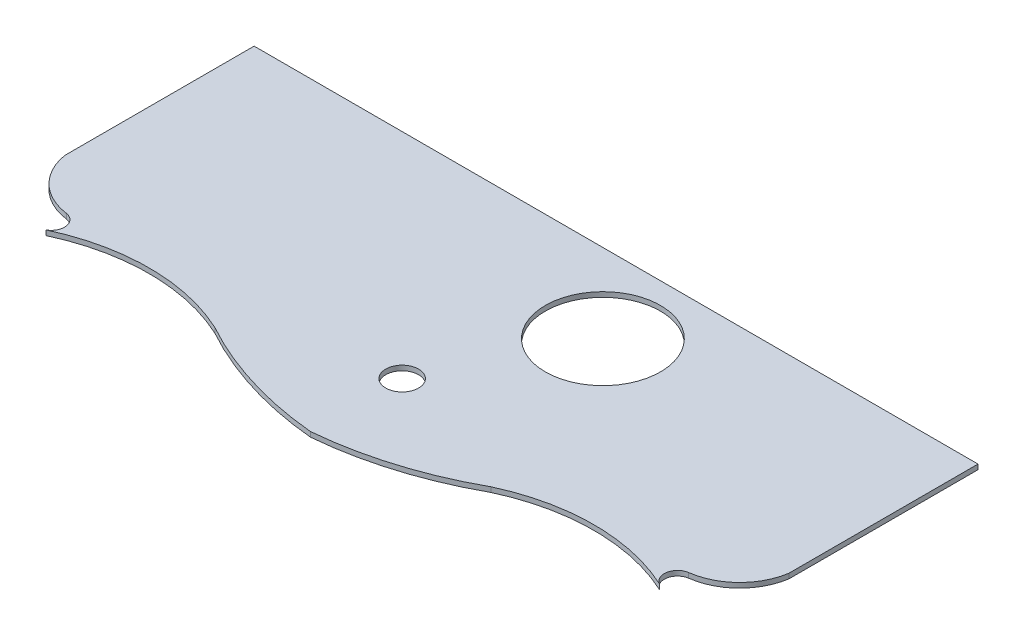
ISO-10303-21;
HEADER;
FILE_DESCRIPTION(('STEP AP214'),'2;1');
FILE_NAME('part.step','',(''),(''),'','','');
FILE_SCHEMA(('AUTOMOTIVE_DESIGN { 1 0 10303 214 1 1 1 1 }'));
ENDSEC;
DATA;
#1=APPLICATION_CONTEXT('core data for automotive mechanical design processes');
#2=APPLICATION_PROTOCOL_DEFINITION('international standard','automotive_design',2000,#1);
#3=PRODUCT_CONTEXT('',#1,'mechanical');
#4=PRODUCT('Part','Part','',(#3));
#5=PRODUCT_RELATED_PRODUCT_CATEGORY('part','',(#4));
#6=PRODUCT_DEFINITION_FORMATION('','',#4);
#7=PRODUCT_DEFINITION_CONTEXT('part definition',#1,'design');
#8=PRODUCT_DEFINITION('design','',#6,#7);
#9=PRODUCT_DEFINITION_SHAPE('','',#8);
#10=(LENGTH_UNIT() NAMED_UNIT(*) SI_UNIT(.MILLI.,.METRE.));
#11=(NAMED_UNIT(*) PLANE_ANGLE_UNIT() SI_UNIT($,.RADIAN.));
#12=(NAMED_UNIT(*) SI_UNIT($,.STERADIAN.) SOLID_ANGLE_UNIT());
#13=UNCERTAINTY_MEASURE_WITH_UNIT(LENGTH_MEASURE(1.E-05),#10,'distance_accuracy_value','');
#14=(GEOMETRIC_REPRESENTATION_CONTEXT(3) GLOBAL_UNCERTAINTY_ASSIGNED_CONTEXT((#13)) GLOBAL_UNIT_ASSIGNED_CONTEXT((#10,
#11,#12)) REPRESENTATION_CONTEXT('',''));
#15=CARTESIAN_POINT('',(0.,0.,0.));
#16=DIRECTION('',(0.,0.,1.));
#17=DIRECTION('',(1.,0.,0.));
#18=AXIS2_PLACEMENT_3D('',#15,#16,#17);
#19=CARTESIAN_POINT('',(-95.1559154698416,243.301123672656,26.4829496841931));
#20=DIRECTION('',(0.,-1.,0.));
#21=DIRECTION('',(0.,0.,-1.));
#22=AXIS2_PLACEMENT_3D('',#19,#20,#21);
#23=CYLINDRICAL_SURFACE('',#22,4.0002695786783);
#24=CARTESIAN_POINT('',(-95.1559154698416,4.5,26.4829496841931));
#25=DIRECTION('',(0.,1.,0.));
#26=DIRECTION('',(0.,0.,1.));
#27=AXIS2_PLACEMENT_3D('',#24,#25,#26);
#28=CIRCLE('',#27,4.0002695786783);
#29=CARTESIAN_POINT('',(-94.5,4.5,22.5368209992004));
#30=VERTEX_POINT('',#29);
#31=CARTESIAN_POINT('',(-93.25,4.5,30.));
#32=VERTEX_POINT('',#31);
#33=EDGE_CURVE('E172',#30,#32,#28,.F.);
#34=ORIENTED_EDGE('',*,*,#33,.F.);
#35=DIRECTION('',(0.,-1.,0.));
#36=VECTOR('',#35,1.);
#37=CARTESIAN_POINT('',(-94.5,243.301123672656,22.5368209992004));
#38=LINE('',#37,#36);
#39=CARTESIAN_POINT('',(-94.5,3.,22.5368209992004));
#40=VERTEX_POINT('',#39);
#41=EDGE_CURVE('E44',#30,#40,#38,.T.);
#42=ORIENTED_EDGE('',*,*,#41,.T.);
#43=CARTESIAN_POINT('',(-95.1559154698416,3.,26.4829496841931));
#44=DIRECTION('',(0.,1.,0.));
#45=DIRECTION('',(0.,0.,1.));
#46=AXIS2_PLACEMENT_3D('',#43,#44,#45);
#47=CIRCLE('',#46,4.0002695786783);
#48=CARTESIAN_POINT('',(-93.25,3.,30.));
#49=VERTEX_POINT('',#48);
#50=EDGE_CURVE('E181',#40,#49,#47,.F.);
#51=ORIENTED_EDGE('',*,*,#50,.T.);
#52=DIRECTION('',(0.,-1.,0.));
#53=VECTOR('',#52,1.);
#54=CARTESIAN_POINT('',(-93.25,243.301123672656,30.));
#55=LINE('',#54,#53);
#56=EDGE_CURVE('E107',#32,#49,#55,.T.);
#57=ORIENTED_EDGE('',*,*,#56,.F.);
#58=EDGE_LOOP('',(#34,#42,#51,#57));
#59=FACE_BOUND('',#58,.T.);
#60=ADVANCED_FACE('F41',(#59),#23,.F.);
#61=CARTESIAN_POINT('',(-67.6062576231202,243.301123672656,85.029602130527));
#62=DIRECTION('',(0.,-1.,0.));
#63=DIRECTION('',(0.,0.,-1.));
#64=AXIS2_PLACEMENT_3D('',#61,#62,#63);
#65=CYLINDRICAL_SURFACE('',#64,60.7112727072649);
#66=CARTESIAN_POINT('',(-67.6062576231202,4.5,85.029602130527));
#67=DIRECTION('',(0.,1.,0.));
#68=DIRECTION('',(0.,0.,1.));
#69=AXIS2_PLACEMENT_3D('',#66,#67,#68);
#70=CIRCLE('',#69,60.7112727072649);
#71=CARTESIAN_POINT('',(-41.9625152462405,4.5,30.));
#72=VERTEX_POINT('',#71);
#73=EDGE_CURVE('E113',#32,#72,#70,.F.);
#74=ORIENTED_EDGE('',*,*,#73,.F.);
#75=ORIENTED_EDGE('',*,*,#56,.T.);
#76=CARTESIAN_POINT('',(-67.6062576231202,3.,85.029602130527));
#77=DIRECTION('',(0.,1.,0.));
#78=DIRECTION('',(0.,0.,1.));
#79=AXIS2_PLACEMENT_3D('',#76,#77,#78);
#80=CIRCLE('',#79,60.7112727072649);
#81=CARTESIAN_POINT('',(-41.9625152462405,3.,30.));
#82=VERTEX_POINT('',#81);
#83=EDGE_CURVE('E185',#49,#82,#80,.F.);
#84=ORIENTED_EDGE('',*,*,#83,.T.);
#85=DIRECTION('',(0.,-1.,0.));
#86=VECTOR('',#85,1.);
#87=CARTESIAN_POINT('',(-41.9625152462405,243.301123672656,30.));
#88=LINE('',#87,#86);
#89=EDGE_CURVE('E184',#72,#82,#88,.T.);
#90=ORIENTED_EDGE('',*,*,#89,.F.);
#91=EDGE_LOOP('',(#74,#75,#84,#90));
#92=FACE_BOUND('',#91,.T.);
#93=ADVANCED_FACE('F245',(#92),#65,.F.);
#94=CARTESIAN_POINT('',(9.52483016864245,243.301123672656,-62.9793470940987));
#95=DIRECTION('',(0.,-1.,0.));
#96=DIRECTION('',(0.,0.,-1.));
#97=AXIS2_PLACEMENT_3D('',#94,#95,#96);
#98=CYLINDRICAL_SURFACE('',#97,106.283139415038);
#99=CARTESIAN_POINT('',(9.52483016864245,4.5,-62.9793470940987));
#100=DIRECTION('',(0.,1.,0.));
#101=DIRECTION('',(0.,0.,1.));
#102=AXIS2_PLACEMENT_3D('',#99,#100,#101);
#103=CIRCLE('',#102,106.283139415038);
#104=CARTESIAN_POINT('',(0.,4.5,42.8761361562973));
#105=VERTEX_POINT('',#104);
#106=EDGE_CURVE('E158',#72,#105,#103,.T.);
#107=ORIENTED_EDGE('',*,*,#106,.F.);
#108=ORIENTED_EDGE('',*,*,#89,.T.);
#109=CARTESIAN_POINT('',(9.52483016864245,3.,-62.9793470940987));
#110=DIRECTION('',(0.,1.,0.));
#111=DIRECTION('',(0.,0.,1.));
#112=AXIS2_PLACEMENT_3D('',#109,#110,#111);
#113=CIRCLE('',#112,106.283139415038);
#114=CARTESIAN_POINT('',(0.,3.,42.8761361562973));
#115=VERTEX_POINT('',#114);
#116=EDGE_CURVE('E173',#82,#115,#113,.T.);
#117=ORIENTED_EDGE('',*,*,#116,.T.);
#118=DIRECTION('',(0.,-1.,0.));
#119=VECTOR('',#118,1.);
#120=CARTESIAN_POINT('',(0.,243.301123672656,42.8761361562973));
#121=LINE('',#120,#119);
#122=EDGE_CURVE('E169',#105,#115,#121,.T.);
#123=ORIENTED_EDGE('',*,*,#122,.F.);
#124=EDGE_LOOP('',(#107,#108,#117,#123));
#125=FACE_BOUND('',#124,.T.);
#126=ADVANCED_FACE('F250',(#125),#98,.T.);
#127=CARTESIAN_POINT('',(-9.52483016864245,243.301123672656,-62.9793470940987));
#128=DIRECTION('',(0.,-1.,0.));
#129=DIRECTION('',(0.,0.,-1.));
#130=AXIS2_PLACEMENT_3D('',#127,#128,#129);
#131=CYLINDRICAL_SURFACE('',#130,106.283139415038);
#132=DIRECTION('',(0.,-1.,0.));
#133=VECTOR('',#132,1.);
#134=CARTESIAN_POINT('',(41.9625152462405,243.301123672656,30.));
#135=LINE('',#134,#133);
#136=CARTESIAN_POINT('',(41.9625152462405,4.5,30.));
#137=VERTEX_POINT('',#136);
#138=CARTESIAN_POINT('',(41.9625152462405,3.,30.));
#139=VERTEX_POINT('',#138);
#140=EDGE_CURVE('E164',#137,#139,#135,.T.);
#141=ORIENTED_EDGE('',*,*,#140,.F.);
#142=CARTESIAN_POINT('',(-9.52483016864245,4.5,-62.9793470940987));
#143=DIRECTION('',(0.,1.,0.));
#144=DIRECTION('',(0.,0.,1.));
#145=AXIS2_PLACEMENT_3D('',#142,#143,#144);
#146=CIRCLE('',#145,106.283139415038);
#147=EDGE_CURVE('E166',#137,#105,#146,.F.);
#148=ORIENTED_EDGE('',*,*,#147,.T.);
#149=ORIENTED_EDGE('',*,*,#122,.T.);
#150=CARTESIAN_POINT('',(-9.52483016864245,3.,-62.9793470940987));
#151=DIRECTION('',(0.,1.,0.));
#152=DIRECTION('',(0.,0.,1.));
#153=AXIS2_PLACEMENT_3D('',#150,#151,#152);
#154=CIRCLE('',#153,106.283139415038);
#155=EDGE_CURVE('E176',#139,#115,#154,.F.);
#156=ORIENTED_EDGE('',*,*,#155,.F.);
#157=EDGE_LOOP('',(#141,#148,#149,#156));
#158=FACE_BOUND('',#157,.T.);
#159=ADVANCED_FACE('F252',(#158),#131,.T.);
#160=CARTESIAN_POINT('',(67.6062576231202,243.301123672656,85.029602130527));
#161=DIRECTION('',(0.,-1.,0.));
#162=DIRECTION('',(0.,0.,-1.));
#163=AXIS2_PLACEMENT_3D('',#160,#161,#162);
#164=CYLINDRICAL_SURFACE('',#163,60.7112727072649);
#165=DIRECTION('',(0.,-1.,0.));
#166=VECTOR('',#165,1.);
#167=CARTESIAN_POINT('',(93.25,243.301123672656,30.));
#168=LINE('',#167,#166);
#169=CARTESIAN_POINT('',(93.25,4.5,30.));
#170=VERTEX_POINT('',#169);
#171=CARTESIAN_POINT('',(93.25,3.,30.));
#172=VERTEX_POINT('',#171);
#173=EDGE_CURVE('E165',#170,#172,#168,.T.);
#174=ORIENTED_EDGE('',*,*,#173,.F.);
#175=CARTESIAN_POINT('',(67.6062576231202,4.5,85.029602130527));
#176=DIRECTION('',(0.,1.,0.));
#177=DIRECTION('',(0.,0.,1.));
#178=AXIS2_PLACEMENT_3D('',#175,#176,#177);
#179=CIRCLE('',#178,60.7112727072649);
#180=EDGE_CURVE('E167',#170,#137,#179,.T.);
#181=ORIENTED_EDGE('',*,*,#180,.T.);
#182=ORIENTED_EDGE('',*,*,#140,.T.);
#183=CARTESIAN_POINT('',(67.6062576231202,3.,85.029602130527));
#184=DIRECTION('',(0.,1.,0.));
#185=DIRECTION('',(0.,0.,1.));
#186=AXIS2_PLACEMENT_3D('',#183,#184,#185);
#187=CIRCLE('',#186,60.7112727072649);
#188=EDGE_CURVE('E213',#172,#139,#187,.T.);
#189=ORIENTED_EDGE('',*,*,#188,.F.);
#190=EDGE_LOOP('',(#174,#181,#182,#189));
#191=FACE_BOUND('',#190,.T.);
#192=ADVANCED_FACE('F258',(#191),#164,.F.);
#193=CARTESIAN_POINT('',(95.1559154698416,243.301123672656,26.4829496841931));
#194=DIRECTION('',(0.,-1.,0.));
#195=DIRECTION('',(0.,0.,-1.));
#196=AXIS2_PLACEMENT_3D('',#193,#194,#195);
#197=CYLINDRICAL_SURFACE('',#196,4.0002695786783);
#198=DIRECTION('',(0.,-1.,0.));
#199=VECTOR('',#198,1.);
#200=CARTESIAN_POINT('',(94.5,243.301123672656,22.5368209992005));
#201=LINE('',#200,#199);
#202=CARTESIAN_POINT('',(94.5,4.5,22.5368209992005));
#203=VERTEX_POINT('',#202);
#204=CARTESIAN_POINT('',(94.5,3.,22.5368209992005));
#205=VERTEX_POINT('',#204);
#206=EDGE_CURVE('E161',#203,#205,#201,.T.);
#207=ORIENTED_EDGE('',*,*,#206,.F.);
#208=CARTESIAN_POINT('',(95.1559154698416,4.5,26.4829496841931));
#209=DIRECTION('',(0.,1.,0.));
#210=DIRECTION('',(0.,0.,1.));
#211=AXIS2_PLACEMENT_3D('',#208,#209,#210);
#212=CIRCLE('',#211,4.0002695786783);
#213=EDGE_CURVE('E162',#203,#170,#212,.T.);
#214=ORIENTED_EDGE('',*,*,#213,.T.);
#215=ORIENTED_EDGE('',*,*,#173,.T.);
#216=CARTESIAN_POINT('',(95.1559154698416,3.,26.4829496841931));
#217=DIRECTION('',(0.,1.,0.));
#218=DIRECTION('',(0.,0.,1.));
#219=AXIS2_PLACEMENT_3D('',#216,#217,#218);
#220=CIRCLE('',#219,4.0002695786783);
#221=EDGE_CURVE('E216',#205,#172,#220,.T.);
#222=ORIENTED_EDGE('',*,*,#221,.F.);
#223=EDGE_LOOP('',(#207,#214,#215,#222));
#224=FACE_BOUND('',#223,.T.);
#225=ADVANCED_FACE('F257',(#224),#197,.F.);
#226=CARTESIAN_POINT('',(92.2220271706997,243.301123672656,4.68154615424297));
#227=DIRECTION('',(0.,-1.,0.));
#228=DIRECTION('',(0.,0.,-1.));
#229=AXIS2_PLACEMENT_3D('',#226,#227,#228);
#230=CYLINDRICAL_SURFACE('',#229,18.);
#231=DIRECTION('',(0.,-1.,0.));
#232=VECTOR('',#231,1.);
#233=CARTESIAN_POINT('',(110.,243.301123672656,7.50000000000001));
#234=LINE('',#233,#232);
#235=CARTESIAN_POINT('',(110.,4.5,7.50000000000001));
#236=VERTEX_POINT('',#235);
#237=CARTESIAN_POINT('',(110.,3.,7.50000000000001));
#238=VERTEX_POINT('',#237);
#239=EDGE_CURVE('E153',#236,#238,#234,.T.);
#240=ORIENTED_EDGE('',*,*,#239,.F.);
#241=CARTESIAN_POINT('',(92.2220271706997,4.5,4.68154615424297));
#242=DIRECTION('',(0.,1.,0.));
#243=DIRECTION('',(0.,0.,1.));
#244=AXIS2_PLACEMENT_3D('',#241,#242,#243);
#245=CIRCLE('',#244,18.);
#246=EDGE_CURVE('E157',#236,#203,#245,.F.);
#247=ORIENTED_EDGE('',*,*,#246,.T.);
#248=ORIENTED_EDGE('',*,*,#206,.T.);
#249=CARTESIAN_POINT('',(92.2220271706997,3.,4.68154615424297));
#250=DIRECTION('',(0.,1.,0.));
#251=DIRECTION('',(0.,0.,1.));
#252=AXIS2_PLACEMENT_3D('',#249,#250,#251);
#253=CIRCLE('',#252,18.);
#254=EDGE_CURVE('E218',#238,#205,#253,.F.);
#255=ORIENTED_EDGE('',*,*,#254,.F.);
#256=EDGE_LOOP('',(#240,#247,#248,#255));
#257=FACE_BOUND('',#256,.T.);
#258=ADVANCED_FACE('F262',(#257),#230,.T.);
#259=CARTESIAN_POINT('',(110.,243.301123672656,0.));
#260=DIRECTION('',(-1.,0.,0.));
#261=DIRECTION('',(0.,0.,1.));
#262=AXIS2_PLACEMENT_3D('',#259,#260,#261);
#263=PLANE('',#262);
#264=DIRECTION('',(0.,0.,-1.));
#265=VECTOR('',#264,1.);
#266=CARTESIAN_POINT('',(110.,4.5,0.));
#267=LINE('',#266,#265);
#268=CARTESIAN_POINT('',(110.,4.5,-50.));
#269=VERTEX_POINT('',#268);
#270=EDGE_CURVE('E49',#236,#269,#267,.T.);
#271=ORIENTED_EDGE('',*,*,#270,.F.);
#272=ORIENTED_EDGE('',*,*,#239,.T.);
#273=DIRECTION('',(0.,0.,-1.));
#274=VECTOR('',#273,1.);
#275=CARTESIAN_POINT('',(110.,3.,0.));
#276=LINE('',#275,#274);
#277=CARTESIAN_POINT('',(110.,3.,-50.));
#278=VERTEX_POINT('',#277);
#279=EDGE_CURVE('E149',#238,#278,#276,.T.);
#280=ORIENTED_EDGE('',*,*,#279,.T.);
#281=DIRECTION('',(0.,-1.,0.));
#282=VECTOR('',#281,1.);
#283=CARTESIAN_POINT('',(110.,243.301123672656,-50.));
#284=LINE('',#283,#282);
#285=EDGE_CURVE('E144',#269,#278,#284,.T.);
#286=ORIENTED_EDGE('',*,*,#285,.F.);
#287=EDGE_LOOP('',(#271,#272,#280,#286));
#288=FACE_BOUND('',#287,.T.);
#289=ADVANCED_FACE('F268',(#288),#263,.F.);
#290=CARTESIAN_POINT('',(0.,243.301123672656,-50.));
#291=DIRECTION('',(0.,0.,-1.));
#292=DIRECTION('',(-1.,0.,0.));
#293=AXIS2_PLACEMENT_3D('',#290,#291,#292);
#294=PLANE('',#293);
#295=DIRECTION('',(0.,-1.,0.));
#296=VECTOR('',#295,1.);
#297=CARTESIAN_POINT('',(-110.,243.301123672656,-50.));
#298=LINE('',#297,#296);
#299=CARTESIAN_POINT('',(-110.,4.5,-50.));
#300=VERTEX_POINT('',#299);
#301=CARTESIAN_POINT('',(-110.,3.,-50.));
#302=VERTEX_POINT('',#301);
#303=EDGE_CURVE('E135',#300,#302,#298,.T.);
#304=ORIENTED_EDGE('',*,*,#303,.F.);
#305=DIRECTION('',(1.,0.,0.));
#306=VECTOR('',#305,1.);
#307=CARTESIAN_POINT('',(0.,4.5,-50.));
#308=LINE('',#307,#306);
#309=EDGE_CURVE('E136',#300,#269,#308,.T.);
#310=ORIENTED_EDGE('',*,*,#309,.T.);
#311=ORIENTED_EDGE('',*,*,#285,.T.);
#312=DIRECTION('',(1.,0.,0.));
#313=VECTOR('',#312,1.);
#314=CARTESIAN_POINT('',(0.,3.,-50.));
#315=LINE('',#314,#313);
#316=EDGE_CURVE('E141',#302,#278,#315,.T.);
#317=ORIENTED_EDGE('',*,*,#316,.F.);
#318=EDGE_LOOP('',(#304,#310,#311,#317));
#319=FACE_BOUND('',#318,.T.);
#320=ADVANCED_FACE('F139',(#319),#294,.T.);
#321=CARTESIAN_POINT('',(-110.,243.301123672656,0.));
#322=DIRECTION('',(1.,0.,0.));
#323=DIRECTION('',(0.,0.,-1.));
#324=AXIS2_PLACEMENT_3D('',#321,#322,#323);
#325=PLANE('',#324);
#326=DIRECTION('',(0.,0.,1.));
#327=VECTOR('',#326,1.);
#328=CARTESIAN_POINT('',(-110.,4.5,0.));
#329=LINE('',#328,#327);
#330=CARTESIAN_POINT('',(-110.,4.5,7.50000000000001));
#331=VERTEX_POINT('',#330);
#332=EDGE_CURVE('E11',#300,#331,#329,.T.);
#333=ORIENTED_EDGE('',*,*,#332,.F.);
#334=ORIENTED_EDGE('',*,*,#303,.T.);
#335=DIRECTION('',(0.,0.,1.));
#336=VECTOR('',#335,1.);
#337=CARTESIAN_POINT('',(-110.,3.,0.));
#338=LINE('',#337,#336);
#339=CARTESIAN_POINT('',(-110.,3.,7.50000000000001));
#340=VERTEX_POINT('',#339);
#341=EDGE_CURVE('E145',#302,#340,#338,.T.);
#342=ORIENTED_EDGE('',*,*,#341,.T.);
#343=DIRECTION('',(0.,-1.,0.));
#344=VECTOR('',#343,1.);
#345=CARTESIAN_POINT('',(-110.,243.301123672656,7.50000000000001));
#346=LINE('',#345,#344);
#347=EDGE_CURVE('E61',#331,#340,#346,.T.);
#348=ORIENTED_EDGE('',*,*,#347,.F.);
#349=EDGE_LOOP('',(#333,#334,#342,#348));
#350=FACE_BOUND('',#349,.T.);
#351=ADVANCED_FACE('F133',(#350),#325,.F.);
#352=CARTESIAN_POINT('',(20.,243.301123672656,-26.));
#353=DIRECTION('',(0.,-1.,0.));
#354=DIRECTION('',(0.,0.,-1.));
#355=AXIS2_PLACEMENT_3D('',#352,#353,#354);
#356=CYLINDRICAL_SURFACE('',#355,17.5);
#357=CARTESIAN_POINT('',(20.,3.,-26.));
#358=DIRECTION('',(0.,1.,0.));
#359=DIRECTION('',(0.,0.,1.));
#360=AXIS2_PLACEMENT_3D('',#357,#358,#359);
#361=CIRCLE('',#360,17.5);
#362=CARTESIAN_POINT('',(20.,3.,-8.49999999999999));
#363=VERTEX_POINT('',#362);
#364=EDGE_CURVE('E201',#363,#363,#361,.T.);
#365=ORIENTED_EDGE('',*,*,#364,.F.);
#366=EDGE_LOOP('',(#365));
#367=FACE_BOUND('',#366,.T.);
#368=CARTESIAN_POINT('',(20.,4.5,-26.));
#369=DIRECTION('',(0.,1.,0.));
#370=DIRECTION('',(0.,0.,1.));
#371=AXIS2_PLACEMENT_3D('',#368,#369,#370);
#372=CIRCLE('',#371,17.5);
#373=CARTESIAN_POINT('',(20.,4.5,-8.49999999999999));
#374=VERTEX_POINT('',#373);
#375=EDGE_CURVE('E191',#374,#374,#372,.T.);
#376=ORIENTED_EDGE('',*,*,#375,.T.);
#377=EDGE_LOOP('',(#376));
#378=FACE_BOUND('',#377,.T.);
#379=ADVANCED_FACE('F240',(#367,#378),#356,.F.);
#380=CARTESIAN_POINT('',(0.,243.301123672656,15.));
#381=DIRECTION('',(0.,-1.,0.));
#382=DIRECTION('',(0.,0.,-1.));
#383=AXIS2_PLACEMENT_3D('',#380,#381,#382);
#384=CYLINDRICAL_SURFACE('',#383,5.);
#385=CARTESIAN_POINT('',(0.,3.,15.));
#386=DIRECTION('',(0.,1.,0.));
#387=DIRECTION('',(0.,0.,1.));
#388=AXIS2_PLACEMENT_3D('',#385,#386,#387);
#389=CIRCLE('',#388,5.);
#390=CARTESIAN_POINT('',(0.,3.,20.));
#391=VERTEX_POINT('',#390);
#392=EDGE_CURVE('E195',#391,#391,#389,.T.);
#393=ORIENTED_EDGE('',*,*,#392,.F.);
#394=EDGE_LOOP('',(#393));
#395=FACE_BOUND('',#394,.T.);
#396=CARTESIAN_POINT('',(0.,4.5,15.));
#397=DIRECTION('',(0.,1.,0.));
#398=DIRECTION('',(0.,0.,1.));
#399=AXIS2_PLACEMENT_3D('',#396,#397,#398);
#400=CIRCLE('',#399,5.);
#401=CARTESIAN_POINT('',(0.,4.5,20.));
#402=VERTEX_POINT('',#401);
#403=EDGE_CURVE('E192',#402,#402,#400,.T.);
#404=ORIENTED_EDGE('',*,*,#403,.T.);
#405=EDGE_LOOP('',(#404));
#406=FACE_BOUND('',#405,.T.);
#407=ADVANCED_FACE('F229',(#395,#406),#384,.F.);
#408=CARTESIAN_POINT('',(-92.2220271706998,243.301123672656,4.68154615424301));
#409=DIRECTION('',(0.,-1.,0.));
#410=DIRECTION('',(0.,0.,-1.));
#411=AXIS2_PLACEMENT_3D('',#408,#409,#410);
#412=CYLINDRICAL_SURFACE('',#411,18.);
#413=CARTESIAN_POINT('',(-92.2220271706998,4.5,4.68154615424301));
#414=DIRECTION('',(0.,1.,0.));
#415=DIRECTION('',(0.,0.,1.));
#416=AXIS2_PLACEMENT_3D('',#413,#414,#415);
#417=CIRCLE('',#416,18.);
#418=EDGE_CURVE('E178',#331,#30,#417,.T.);
#419=ORIENTED_EDGE('',*,*,#418,.F.);
#420=ORIENTED_EDGE('',*,*,#347,.T.);
#421=CARTESIAN_POINT('',(-92.2220271706998,3.,4.68154615424301));
#422=DIRECTION('',(0.,1.,0.));
#423=DIRECTION('',(0.,0.,1.));
#424=AXIS2_PLACEMENT_3D('',#421,#422,#423);
#425=CIRCLE('',#424,18.);
#426=EDGE_CURVE('E187',#340,#40,#425,.T.);
#427=ORIENTED_EDGE('',*,*,#426,.T.);
#428=ORIENTED_EDGE('',*,*,#41,.F.);
#429=EDGE_LOOP('',(#419,#420,#427,#428));
#430=FACE_BOUND('',#429,.T.);
#431=ADVANCED_FACE('F230',(#430),#412,.T.);
#432=CARTESIAN_POINT('',(0.,3.,0.));
#433=DIRECTION('',(0.,1.,0.));
#434=DIRECTION('',(0.,0.,1.));
#435=AXIS2_PLACEMENT_3D('',#432,#433,#434);
#436=PLANE('',#435);
#437=ORIENTED_EDGE('',*,*,#392,.T.);
#438=EDGE_LOOP('',(#437));
#439=FACE_BOUND('',#438,.T.);
#440=ORIENTED_EDGE('',*,*,#364,.T.);
#441=EDGE_LOOP('',(#440));
#442=FACE_BOUND('',#441,.T.);
#443=ORIENTED_EDGE('',*,*,#50,.F.);
#444=ORIENTED_EDGE('',*,*,#426,.F.);
#445=ORIENTED_EDGE('',*,*,#341,.F.);
#446=ORIENTED_EDGE('',*,*,#316,.T.);
#447=ORIENTED_EDGE('',*,*,#279,.F.);
#448=ORIENTED_EDGE('',*,*,#254,.T.);
#449=ORIENTED_EDGE('',*,*,#221,.T.);
#450=ORIENTED_EDGE('',*,*,#188,.T.);
#451=ORIENTED_EDGE('',*,*,#155,.T.);
#452=ORIENTED_EDGE('',*,*,#116,.F.);
#453=ORIENTED_EDGE('',*,*,#83,.F.);
#454=EDGE_LOOP('',(#443,#444,#445,#446,#447,#448,#449,#450,#451,#452,#453));
#455=FACE_BOUND('',#454,.T.);
#456=ADVANCED_FACE('F228',(#439,#442,#455),#436,.F.);
#457=CARTESIAN_POINT('',(0.,4.5,0.));
#458=DIRECTION('',(0.,1.,0.));
#459=DIRECTION('',(0.,0.,1.));
#460=AXIS2_PLACEMENT_3D('',#457,#458,#459);
#461=PLANE('',#460);
#462=ORIENTED_EDGE('',*,*,#375,.F.);
#463=EDGE_LOOP('',(#462));
#464=FACE_BOUND('',#463,.T.);
#465=ORIENTED_EDGE('',*,*,#403,.F.);
#466=EDGE_LOOP('',(#465));
#467=FACE_BOUND('',#466,.T.);
#468=ORIENTED_EDGE('',*,*,#418,.T.);
#469=ORIENTED_EDGE('',*,*,#33,.T.);
#470=ORIENTED_EDGE('',*,*,#73,.T.);
#471=ORIENTED_EDGE('',*,*,#106,.T.);
#472=ORIENTED_EDGE('',*,*,#147,.F.);
#473=ORIENTED_EDGE('',*,*,#180,.F.);
#474=ORIENTED_EDGE('',*,*,#213,.F.);
#475=ORIENTED_EDGE('',*,*,#246,.F.);
#476=ORIENTED_EDGE('',*,*,#270,.T.);
#477=ORIENTED_EDGE('',*,*,#309,.F.);
#478=ORIENTED_EDGE('',*,*,#332,.T.);
#479=EDGE_LOOP('',(#468,#469,#470,#471,#472,#473,#474,#475,#476,#477,#478));
#480=FACE_BOUND('',#479,.T.);
#481=ADVANCED_FACE('F43',(#464,#467,#480),#461,.T.);
#482=CLOSED_SHELL('',(#60,#93,#126,#159,#192,#225,#258,#289,#320,#351,#379,#407,#431,#456,#481));
#483=MANIFOLD_SOLID_BREP('B2',#482);
#484=ADVANCED_BREP_SHAPE_REPRESENTATION('',(#18,#483),#14);
#485=SHAPE_DEFINITION_REPRESENTATION(#9,#484);
ENDSEC;
END-ISO-10303-21;
